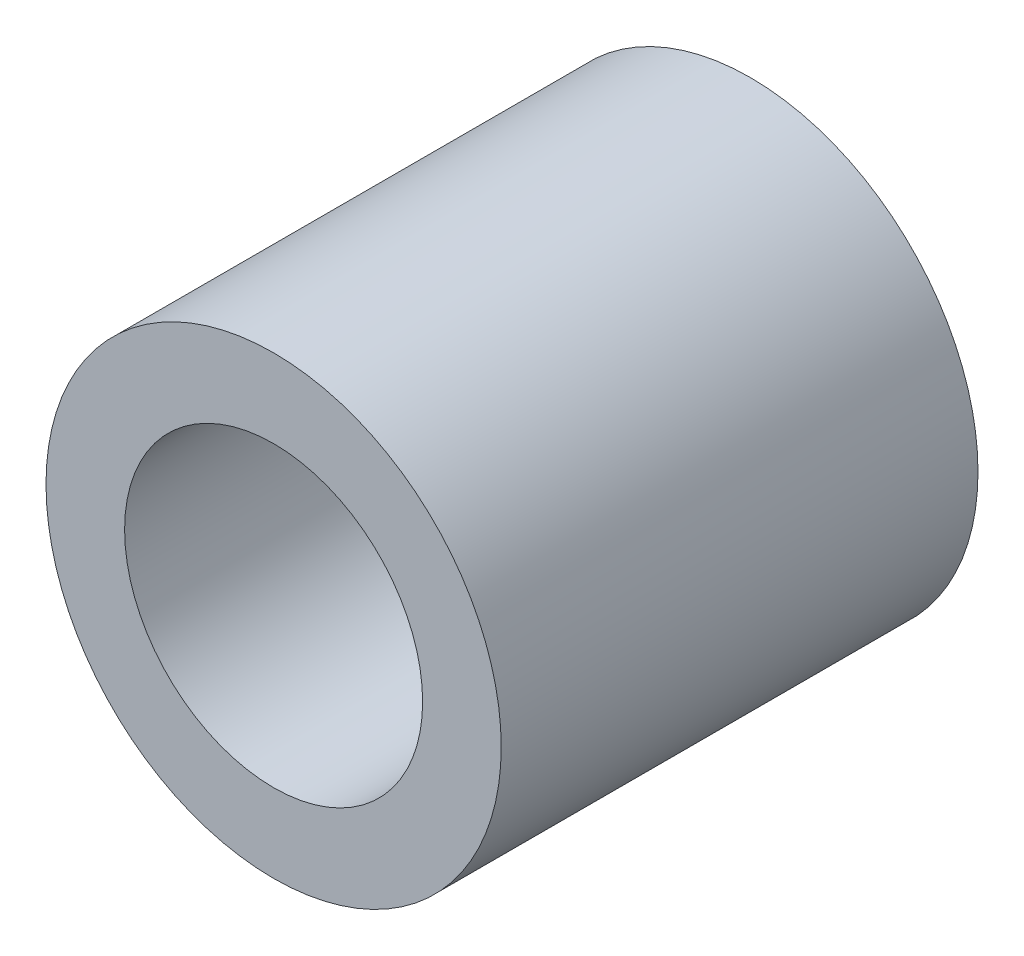
ISO-10303-21;
HEADER;
FILE_DESCRIPTION(('STEP AP214'),'2;1');
FILE_NAME('part.step','',(''),(''),'','','');
FILE_SCHEMA(('AUTOMOTIVE_DESIGN { 1 0 10303 214 1 1 1 1 }'));
ENDSEC;
DATA;
#1=APPLICATION_CONTEXT('core data for automotive mechanical design processes');
#2=APPLICATION_PROTOCOL_DEFINITION('international standard','automotive_design',2000,#1);
#3=PRODUCT_CONTEXT('',#1,'mechanical');
#4=PRODUCT('Part','Part','',(#3));
#5=PRODUCT_RELATED_PRODUCT_CATEGORY('part','',(#4));
#6=PRODUCT_DEFINITION_FORMATION('','',#4);
#7=PRODUCT_DEFINITION_CONTEXT('part definition',#1,'design');
#8=PRODUCT_DEFINITION('design','',#6,#7);
#9=PRODUCT_DEFINITION_SHAPE('','',#8);
#10=(LENGTH_UNIT() NAMED_UNIT(*) SI_UNIT(.MILLI.,.METRE.));
#11=(NAMED_UNIT(*) PLANE_ANGLE_UNIT() SI_UNIT($,.RADIAN.));
#12=(NAMED_UNIT(*) SI_UNIT($,.STERADIAN.) SOLID_ANGLE_UNIT());
#13=UNCERTAINTY_MEASURE_WITH_UNIT(LENGTH_MEASURE(1.E-05),#10,'distance_accuracy_value','');
#14=(GEOMETRIC_REPRESENTATION_CONTEXT(3) GLOBAL_UNCERTAINTY_ASSIGNED_CONTEXT((#13)) GLOBAL_UNIT_ASSIGNED_CONTEXT((#10,
#11,#12)) REPRESENTATION_CONTEXT('',''));
#15=CARTESIAN_POINT('',(0.,0.,0.));
#16=DIRECTION('',(0.,0.,1.));
#17=DIRECTION('',(1.,0.,0.));
#18=AXIS2_PLACEMENT_3D('',#15,#16,#17);
#19=CARTESIAN_POINT('',(0.,0.,7.61873));
#20=DIRECTION('',(0.,0.,1.));
#21=DIRECTION('',(1.,0.,0.));
#22=AXIS2_PLACEMENT_3D('',#19,#20,#21);
#23=PLANE('',#22);
#24=CARTESIAN_POINT('',(0.,0.,7.61873));
#25=DIRECTION('',(0.,0.,1.));
#26=DIRECTION('',(1.,0.,0.));
#27=AXIS2_PLACEMENT_3D('',#24,#25,#26);
#28=CIRCLE('',#27,7.27456);
#29=CARTESIAN_POINT('',(-7.27456,0.,7.61873));
#30=VERTEX_POINT('',#29);
#31=EDGE_CURVE('E10',#30,#30,#28,.T.);
#32=ORIENTED_EDGE('',*,*,#31,.T.);
#33=EDGE_LOOP('',(#32));
#34=FACE_BOUND('',#33,.T.);
#35=CARTESIAN_POINT('',(0.,0.,7.61873));
#36=DIRECTION('',(0.,0.,1.));
#37=DIRECTION('',(1.,0.,0.));
#38=AXIS2_PLACEMENT_3D('',#35,#36,#37);
#39=CIRCLE('',#38,4.7625);
#40=CARTESIAN_POINT('',(-4.7625,0.,7.61873));
#41=VERTEX_POINT('',#40);
#42=EDGE_CURVE('E54',#41,#41,#39,.T.);
#43=ORIENTED_EDGE('',*,*,#42,.F.);
#44=EDGE_LOOP('',(#43));
#45=FACE_BOUND('',#44,.T.);
#46=ADVANCED_FACE('F41',(#34,#45),#23,.T.);
#47=CARTESIAN_POINT('',(0.,0.,-7.61873));
#48=DIRECTION('',(0.,0.,1.));
#49=DIRECTION('',(1.,0.,0.));
#50=AXIS2_PLACEMENT_3D('',#47,#48,#49);
#51=PLANE('',#50);
#52=CARTESIAN_POINT('',(0.,0.,-7.61873));
#53=DIRECTION('',(0.,0.,1.));
#54=DIRECTION('',(1.,0.,0.));
#55=AXIS2_PLACEMENT_3D('',#52,#53,#54);
#56=CIRCLE('',#55,7.27456);
#57=CARTESIAN_POINT('',(-7.27456,0.,-7.61873));
#58=VERTEX_POINT('',#57);
#59=EDGE_CURVE('E45',#58,#58,#56,.T.);
#60=ORIENTED_EDGE('',*,*,#59,.F.);
#61=EDGE_LOOP('',(#60));
#62=FACE_BOUND('',#61,.T.);
#63=CARTESIAN_POINT('',(0.,0.,-7.61873));
#64=DIRECTION('',(0.,0.,1.));
#65=DIRECTION('',(1.,0.,0.));
#66=AXIS2_PLACEMENT_3D('',#63,#64,#65);
#67=CIRCLE('',#66,4.7625);
#68=CARTESIAN_POINT('',(-4.7625,0.,-7.61873));
#69=VERTEX_POINT('',#68);
#70=EDGE_CURVE('E56',#69,#69,#67,.T.);
#71=ORIENTED_EDGE('',*,*,#70,.T.);
#72=EDGE_LOOP('',(#71));
#73=FACE_BOUND('',#72,.T.);
#74=ADVANCED_FACE('F68',(#62,#73),#51,.F.);
#75=CARTESIAN_POINT('',(0.,0.,7.61873));
#76=DIRECTION('',(0.,0.,-1.));
#77=DIRECTION('',(-1.,0.,0.));
#78=AXIS2_PLACEMENT_3D('',#75,#76,#77);
#79=CYLINDRICAL_SURFACE('',#78,7.27456);
#80=CARTESIAN_POINT('',(-7.27456,0.,7.61873));
#81=CARTESIAN_POINT('',(-7.27456,0.,7.46000645833333));
#82=CARTESIAN_POINT('',(-7.27456,0.,7.30128291666667));
#83=CARTESIAN_POINT('',(-7.27456,0.,6.98383583333333));
#84=CARTESIAN_POINT('',(-7.27456,0.,6.82511229166667));
#85=CARTESIAN_POINT('',(-7.27456,0.,6.50766520833333));
#86=CARTESIAN_POINT('',(-7.27456,0.,6.34894166666667));
#87=CARTESIAN_POINT('',(-7.27456,0.,6.03149458333333));
#88=CARTESIAN_POINT('',(-7.27456,0.,5.87277104166667));
#89=CARTESIAN_POINT('',(-7.27456,0.,5.55532395833333));
#90=CARTESIAN_POINT('',(-7.27456,0.,5.39660041666667));
#91=CARTESIAN_POINT('',(-7.27456,0.,5.07915333333333));
#92=CARTESIAN_POINT('',(-7.27456,0.,4.92042979166667));
#93=CARTESIAN_POINT('',(-7.27456,0.,4.60298270833333));
#94=CARTESIAN_POINT('',(-7.27456,0.,4.44425916666667));
#95=CARTESIAN_POINT('',(-7.27456,0.,4.12681208333333));
#96=CARTESIAN_POINT('',(-7.27456,0.,3.96808854166667));
#97=CARTESIAN_POINT('',(-7.27456,0.,3.65064145833333));
#98=CARTESIAN_POINT('',(-7.27456,0.,3.49191791666667));
#99=CARTESIAN_POINT('',(-7.27456,0.,3.17447083333333));
#100=CARTESIAN_POINT('',(-7.27456,0.,3.01574729166667));
#101=CARTESIAN_POINT('',(-7.27456,0.,2.69830020833333));
#102=CARTESIAN_POINT('',(-7.27456,0.,2.53957666666667));
#103=CARTESIAN_POINT('',(-7.27456,0.,2.22212958333333));
#104=CARTESIAN_POINT('',(-7.27456,0.,2.06340604166667));
#105=CARTESIAN_POINT('',(-7.27456,0.,1.74595895833333));
#106=CARTESIAN_POINT('',(-7.27456,0.,1.58723541666667));
#107=CARTESIAN_POINT('',(-7.27456,0.,1.26978833333333));
#108=CARTESIAN_POINT('',(-7.27456,0.,1.11106479166667));
#109=CARTESIAN_POINT('',(-7.27456,0.,0.793617708333334));
#110=CARTESIAN_POINT('',(-7.27456,0.,0.634894166666667));
#111=CARTESIAN_POINT('',(-7.27456,0.,0.317447083333333));
#112=CARTESIAN_POINT('',(-7.27456,0.,0.158723541666667));
#113=CARTESIAN_POINT('',(-7.27456,0.,-0.158723541666666));
#114=CARTESIAN_POINT('',(-7.27456,0.,-0.317447083333332));
#115=CARTESIAN_POINT('',(-7.27456,0.,-0.634894166666666));
#116=CARTESIAN_POINT('',(-7.27456,0.,-0.793617708333333));
#117=CARTESIAN_POINT('',(-7.27456,0.,-1.11106479166667));
#118=CARTESIAN_POINT('',(-7.27456,0.,-1.26978833333333));
#119=CARTESIAN_POINT('',(-7.27456,0.,-1.58723541666667));
#120=CARTESIAN_POINT('',(-7.27456,0.,-1.74595895833333));
#121=CARTESIAN_POINT('',(-7.27456,0.,-2.06340604166667));
#122=CARTESIAN_POINT('',(-7.27456,0.,-2.22212958333333));
#123=CARTESIAN_POINT('',(-7.27456,0.,-2.53957666666667));
#124=CARTESIAN_POINT('',(-7.27456,0.,-2.69830020833333));
#125=CARTESIAN_POINT('',(-7.27456,0.,-3.01574729166667));
#126=CARTESIAN_POINT('',(-7.27456,0.,-3.17447083333333));
#127=CARTESIAN_POINT('',(-7.27456,0.,-3.49191791666667));
#128=CARTESIAN_POINT('',(-7.27456,0.,-3.65064145833333));
#129=CARTESIAN_POINT('',(-7.27456,0.,-3.96808854166667));
#130=CARTESIAN_POINT('',(-7.27456,0.,-4.12681208333333));
#131=CARTESIAN_POINT('',(-7.27456,0.,-4.44425916666667));
#132=CARTESIAN_POINT('',(-7.27456,0.,-4.60298270833333));
#133=CARTESIAN_POINT('',(-7.27456,0.,-4.92042979166667));
#134=CARTESIAN_POINT('',(-7.27456,0.,-5.07915333333333));
#135=CARTESIAN_POINT('',(-7.27456,0.,-5.39660041666667));
#136=CARTESIAN_POINT('',(-7.27456,0.,-5.55532395833333));
#137=CARTESIAN_POINT('',(-7.27456,0.,-5.87277104166667));
#138=CARTESIAN_POINT('',(-7.27456,0.,-6.03149458333333));
#139=CARTESIAN_POINT('',(-7.27456,0.,-6.34894166666667));
#140=CARTESIAN_POINT('',(-7.27456,0.,-6.50766520833333));
#141=CARTESIAN_POINT('',(-7.27456,0.,-6.82511229166667));
#142=CARTESIAN_POINT('',(-7.27456,0.,-6.98383583333333));
#143=CARTESIAN_POINT('',(-7.27456,0.,-7.30128291666667));
#144=CARTESIAN_POINT('',(-7.27456,0.,-7.46000645833333));
#145=CARTESIAN_POINT('',(-7.27456,0.,-7.61873));
#146=B_SPLINE_CURVE_WITH_KNOTS('',3,(#80,#81,#82,#83,#84,#85,#86,#87,#88,#89,#90,#91,#92,#93,
#94,#95,#96,#97,#98,#99,#100,#101,#102,#103,#104,#105,#106,#107,#108,#109,#110,#111,#112,#113,
#114,#115,#116,#117,#118,#119,#120,#121,#122,#123,#124,#125,#126,#127,#128,#129,#130,#131,#132,
#133,#134,#135,#136,#137,#138,#139,#140,#141,#142,#143,#144,#145),.UNSPECIFIED.,.F.,.F.,(4,2,2,
2,2,2,2,2,2,2,2,2,2,2,2,2,2,2,2,2,2,2,2,2,2,2,2,2,2,2,2,2,4),(0.,0.476170625,0.95234125,
1.428511875,1.9046825,2.380853125,2.85702375,3.333194375,3.809365,4.285535625,4.76170625,
5.237876875,5.7140475,6.190218125,6.66638875,7.142559375,7.61873,8.094900625,8.57107125,
9.047241875,9.5234125,9.999583125,10.47575375,10.951924375,11.428095,11.904265625,12.38043625,
12.856606875,13.3327775,13.808948125,14.28511875,14.761289375,15.23746),.UNSPECIFIED.);
#147=EDGE_CURVE('BSEAM43',#30,#58,#146,.T.);
#148=ORIENTED_EDGE('',*,*,#31,.F.);
#149=ORIENTED_EDGE('',*,*,#59,.T.);
#150=ORIENTED_EDGE('',*,*,#147,.T.);
#151=ORIENTED_EDGE('',*,*,#147,.F.);
#152=EDGE_LOOP('',(#148,#150,#149,#151));
#153=FACE_BOUND('',#152,.T.);
#154=ADVANCED_FACE('F43',(#153),#79,.T.);
#155=CARTESIAN_POINT('',(0.,0.,7.61873));
#156=DIRECTION('',(0.,0.,-1.));
#157=DIRECTION('',(-1.,0.,0.));
#158=AXIS2_PLACEMENT_3D('',#155,#156,#157);
#159=CYLINDRICAL_SURFACE('',#158,4.7625);
#160=CARTESIAN_POINT('',(-4.7625,0.,7.61873));
#161=CARTESIAN_POINT('',(-4.7625,0.,7.46000645833333));
#162=CARTESIAN_POINT('',(-4.7625,0.,7.30128291666667));
#163=CARTESIAN_POINT('',(-4.7625,0.,6.98383583333333));
#164=CARTESIAN_POINT('',(-4.7625,0.,6.82511229166667));
#165=CARTESIAN_POINT('',(-4.7625,0.,6.50766520833333));
#166=CARTESIAN_POINT('',(-4.7625,0.,6.34894166666667));
#167=CARTESIAN_POINT('',(-4.7625,0.,6.03149458333333));
#168=CARTESIAN_POINT('',(-4.7625,0.,5.87277104166667));
#169=CARTESIAN_POINT('',(-4.7625,0.,5.55532395833333));
#170=CARTESIAN_POINT('',(-4.7625,0.,5.39660041666667));
#171=CARTESIAN_POINT('',(-4.7625,0.,5.07915333333333));
#172=CARTESIAN_POINT('',(-4.7625,0.,4.92042979166667));
#173=CARTESIAN_POINT('',(-4.7625,0.,4.60298270833333));
#174=CARTESIAN_POINT('',(-4.7625,0.,4.44425916666667));
#175=CARTESIAN_POINT('',(-4.7625,0.,4.12681208333333));
#176=CARTESIAN_POINT('',(-4.7625,0.,3.96808854166667));
#177=CARTESIAN_POINT('',(-4.7625,0.,3.65064145833333));
#178=CARTESIAN_POINT('',(-4.7625,0.,3.49191791666667));
#179=CARTESIAN_POINT('',(-4.7625,0.,3.17447083333333));
#180=CARTESIAN_POINT('',(-4.7625,0.,3.01574729166667));
#181=CARTESIAN_POINT('',(-4.7625,0.,2.69830020833333));
#182=CARTESIAN_POINT('',(-4.7625,0.,2.53957666666667));
#183=CARTESIAN_POINT('',(-4.7625,0.,2.22212958333333));
#184=CARTESIAN_POINT('',(-4.7625,0.,2.06340604166667));
#185=CARTESIAN_POINT('',(-4.7625,0.,1.74595895833333));
#186=CARTESIAN_POINT('',(-4.7625,0.,1.58723541666667));
#187=CARTESIAN_POINT('',(-4.7625,0.,1.26978833333333));
#188=CARTESIAN_POINT('',(-4.7625,0.,1.11106479166667));
#189=CARTESIAN_POINT('',(-4.7625,0.,0.793617708333334));
#190=CARTESIAN_POINT('',(-4.7625,0.,0.634894166666667));
#191=CARTESIAN_POINT('',(-4.7625,0.,0.317447083333333));
#192=CARTESIAN_POINT('',(-4.7625,0.,0.158723541666667));
#193=CARTESIAN_POINT('',(-4.7625,0.,-0.158723541666666));
#194=CARTESIAN_POINT('',(-4.7625,0.,-0.317447083333332));
#195=CARTESIAN_POINT('',(-4.7625,0.,-0.634894166666666));
#196=CARTESIAN_POINT('',(-4.7625,0.,-0.793617708333333));
#197=CARTESIAN_POINT('',(-4.7625,0.,-1.11106479166667));
#198=CARTESIAN_POINT('',(-4.7625,0.,-1.26978833333333));
#199=CARTESIAN_POINT('',(-4.7625,0.,-1.58723541666667));
#200=CARTESIAN_POINT('',(-4.7625,0.,-1.74595895833333));
#201=CARTESIAN_POINT('',(-4.7625,0.,-2.06340604166667));
#202=CARTESIAN_POINT('',(-4.7625,0.,-2.22212958333333));
#203=CARTESIAN_POINT('',(-4.7625,0.,-2.53957666666667));
#204=CARTESIAN_POINT('',(-4.7625,0.,-2.69830020833333));
#205=CARTESIAN_POINT('',(-4.7625,0.,-3.01574729166667));
#206=CARTESIAN_POINT('',(-4.7625,0.,-3.17447083333333));
#207=CARTESIAN_POINT('',(-4.7625,0.,-3.49191791666667));
#208=CARTESIAN_POINT('',(-4.7625,0.,-3.65064145833333));
#209=CARTESIAN_POINT('',(-4.7625,0.,-3.96808854166667));
#210=CARTESIAN_POINT('',(-4.7625,0.,-4.12681208333333));
#211=CARTESIAN_POINT('',(-4.7625,0.,-4.44425916666667));
#212=CARTESIAN_POINT('',(-4.7625,0.,-4.60298270833333));
#213=CARTESIAN_POINT('',(-4.7625,0.,-4.92042979166667));
#214=CARTESIAN_POINT('',(-4.7625,0.,-5.07915333333333));
#215=CARTESIAN_POINT('',(-4.7625,0.,-5.39660041666667));
#216=CARTESIAN_POINT('',(-4.7625,0.,-5.55532395833333));
#217=CARTESIAN_POINT('',(-4.7625,0.,-5.87277104166667));
#218=CARTESIAN_POINT('',(-4.7625,0.,-6.03149458333333));
#219=CARTESIAN_POINT('',(-4.7625,0.,-6.34894166666667));
#220=CARTESIAN_POINT('',(-4.7625,0.,-6.50766520833333));
#221=CARTESIAN_POINT('',(-4.7625,0.,-6.82511229166667));
#222=CARTESIAN_POINT('',(-4.7625,0.,-6.98383583333333));
#223=CARTESIAN_POINT('',(-4.7625,0.,-7.30128291666667));
#224=CARTESIAN_POINT('',(-4.7625,0.,-7.46000645833333));
#225=CARTESIAN_POINT('',(-4.7625,0.,-7.61873));
#226=B_SPLINE_CURVE_WITH_KNOTS('',3,(#160,#161,#162,#163,#164,#165,#166,#167,#168,#169,#170,
#171,#172,#173,#174,#175,#176,#177,#178,#179,#180,#181,#182,#183,#184,#185,#186,#187,#188,#189,
#190,#191,#192,#193,#194,#195,#196,#197,#198,#199,#200,#201,#202,#203,#204,#205,#206,#207,#208,
#209,#210,#211,#212,#213,#214,#215,#216,#217,#218,#219,#220,#221,#222,#223,#224,#225),
.UNSPECIFIED.,.F.,.F.,(4,2,2,2,2,2,2,2,2,2,2,2,2,2,2,2,2,2,2,2,2,2,2,2,2,2,2,2,2,2,2,2,4),(0.,
0.476170625,0.95234125,1.428511875,1.9046825,2.380853125,2.85702375,3.333194375,3.809365,
4.285535625,4.76170625,5.237876875,5.7140475,6.190218125,6.66638875,7.142559375,7.61873,
8.094900625,8.57107125,9.047241875,9.5234125,9.999583125,10.47575375,10.951924375,11.428095,
11.904265625,12.38043625,12.856606875,13.3327775,13.808948125,14.28511875,14.761289375,
15.23746),.UNSPECIFIED.);
#227=EDGE_CURVE('BSEAM64',#41,#69,#226,.T.);
#228=ORIENTED_EDGE('',*,*,#42,.T.);
#229=ORIENTED_EDGE('',*,*,#70,.F.);
#230=ORIENTED_EDGE('',*,*,#227,.T.);
#231=ORIENTED_EDGE('',*,*,#227,.F.);
#232=EDGE_LOOP('',(#228,#230,#229,#231));
#233=FACE_BOUND('',#232,.T.);
#234=ADVANCED_FACE('F64',(#233),#159,.F.);
#235=CLOSED_SHELL('',(#46,#74,#154,#234));
#236=MANIFOLD_SOLID_BREP('B2',#235);
#237=ADVANCED_BREP_SHAPE_REPRESENTATION('',(#18,#236),#14);
#238=SHAPE_DEFINITION_REPRESENTATION(#9,#237);
ENDSEC;
END-ISO-10303-21;
